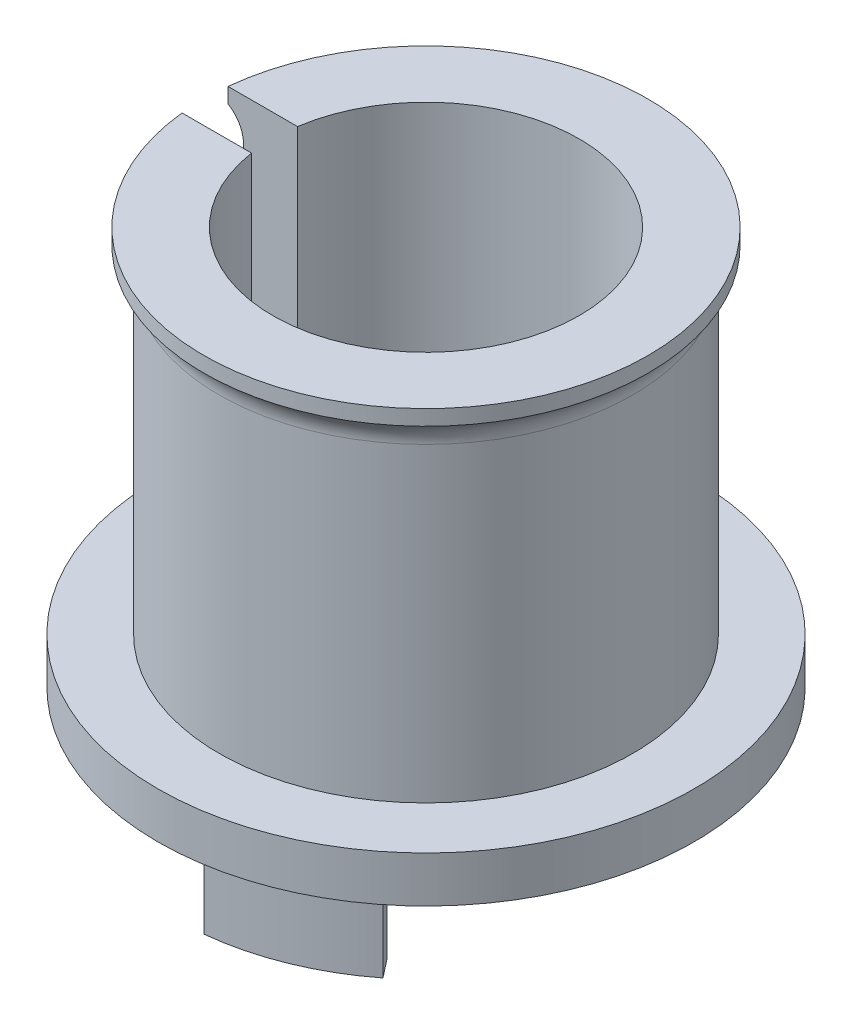
ISO-10303-21;
HEADER;
FILE_DESCRIPTION(('STEP AP214'),'2;1');
FILE_NAME('part.step','',(''),(''),'','','');
FILE_SCHEMA(('AUTOMOTIVE_DESIGN { 1 0 10303 214 1 1 1 1 }'));
ENDSEC;
DATA;
#1=APPLICATION_CONTEXT('core data for automotive mechanical design processes');
#2=APPLICATION_PROTOCOL_DEFINITION('international standard','automotive_design',2000,#1);
#3=PRODUCT_CONTEXT('',#1,'mechanical');
#4=PRODUCT('Part','Part','',(#3));
#5=PRODUCT_RELATED_PRODUCT_CATEGORY('part','',(#4));
#6=PRODUCT_DEFINITION_FORMATION('','',#4);
#7=PRODUCT_DEFINITION_CONTEXT('part definition',#1,'design');
#8=PRODUCT_DEFINITION('design','',#6,#7);
#9=PRODUCT_DEFINITION_SHAPE('','',#8);
#10=(LENGTH_UNIT() NAMED_UNIT(*) SI_UNIT(.MILLI.,.METRE.));
#11=(NAMED_UNIT(*) PLANE_ANGLE_UNIT() SI_UNIT($,.RADIAN.));
#12=(NAMED_UNIT(*) SI_UNIT($,.STERADIAN.) SOLID_ANGLE_UNIT());
#13=UNCERTAINTY_MEASURE_WITH_UNIT(LENGTH_MEASURE(1.E-05),#10,'distance_accuracy_value','');
#14=(GEOMETRIC_REPRESENTATION_CONTEXT(3) GLOBAL_UNCERTAINTY_ASSIGNED_CONTEXT((#13)) GLOBAL_UNIT_ASSIGNED_CONTEXT((#10,
#11,#12)) REPRESENTATION_CONTEXT('',''));
#15=CARTESIAN_POINT('',(0.,0.,0.));
#16=DIRECTION('',(0.,0.,1.));
#17=DIRECTION('',(1.,0.,0.));
#18=AXIS2_PLACEMENT_3D('',#15,#16,#17);
#19=CARTESIAN_POINT('',(0.,-3.,0.));
#20=DIRECTION('',(0.,1.,0.));
#21=DIRECTION('',(0.,0.,1.));
#22=AXIS2_PLACEMENT_3D('',#19,#20,#21);
#23=PLANE('',#22);
#24=CARTESIAN_POINT('',(0.,-3.,0.));
#25=DIRECTION('',(0.,1.,0.));
#26=DIRECTION('',(0.,0.,-1.));
#27=AXIS2_PLACEMENT_3D('',#24,#25,#26);
#28=CIRCLE('',#27,14.8);
#29=CARTESIAN_POINT('',(9.11178983481976,-3.,-11.6625591533795));
#30=VERTEX_POINT('',#29);
#31=CARTESIAN_POINT('',(1.54702125636129,-3.,-14.7189240514504));
#32=VERTEX_POINT('',#31);
#33=EDGE_CURVE('E116',#30,#32,#28,.T.);
#34=ORIENTED_EDGE('',*,*,#33,.F.);
#35=DIRECTION('',(-0.61566147532566,0.,0.78801075360672));
#36=VECTOR('',#35,1.);
#37=CARTESIAN_POINT('',(9.11178983481976,-3.,-11.6625591533795));
#38=LINE('',#37,#36);
#39=CARTESIAN_POINT('',(10.0352820478083,-3.,-12.8445752837895));
#40=VERTEX_POINT('',#39);
#41=EDGE_CURVE('E149',#40,#30,#38,.T.);
#42=ORIENTED_EDGE('',*,*,#41,.F.);
#43=CARTESIAN_POINT('',(0.,-3.,0.));
#44=DIRECTION('',(0.,-1.,0.));
#45=DIRECTION('',(0.,0.,-1.));
#46=AXIS2_PLACEMENT_3D('',#43,#44,#45);
#47=CIRCLE('',#46,16.3);
#48=CARTESIAN_POINT('',(1.70381395126277,-3.,-16.2107068945029));
#49=VERTEX_POINT('',#48);
#50=EDGE_CURVE('E161',#49,#40,#47,.T.);
#51=ORIENTED_EDGE('',*,*,#50,.F.);
#52=DIRECTION('',(0.104528463267654,0.,-0.994521895368273));
#53=VECTOR('',#52,1.);
#54=CARTESIAN_POINT('',(1.54702125636129,-3.,-14.7189240514504));
#55=LINE('',#54,#53);
#56=EDGE_CURVE('E158',#32,#49,#55,.T.);
#57=ORIENTED_EDGE('',*,*,#56,.F.);
#58=EDGE_LOOP('',(#34,#42,#51,#57));
#59=FACE_BOUND('',#58,.T.);
#60=CARTESIAN_POINT('',(0.,-3.,0.));
#61=DIRECTION('',(0.,1.,0.));
#62=DIRECTION('',(0.,0.,1.));
#63=AXIS2_PLACEMENT_3D('',#60,#61,#62);
#64=CIRCLE('',#63,17.5);
#65=CARTESIAN_POINT('',(0.,-3.,17.5));
#66=VERTEX_POINT('',#65);
#67=EDGE_CURVE('E56',#66,#66,#64,.T.);
#68=ORIENTED_EDGE('',*,*,#67,.F.);
#69=EDGE_LOOP('',(#68));
#70=FACE_BOUND('',#69,.T.);
#71=CARTESIAN_POINT('',(0.,-3.,0.));
#72=DIRECTION('',(0.,1.,0.));
#73=DIRECTION('',(0.,0.,1.));
#74=AXIS2_PLACEMENT_3D('',#71,#72,#73);
#75=CIRCLE('',#74,10.);
#76=CARTESIAN_POINT('',(0.,-3.,10.));
#77=VERTEX_POINT('',#76);
#78=EDGE_CURVE('E12',#77,#77,#75,.T.);
#79=ORIENTED_EDGE('',*,*,#78,.T.);
#80=EDGE_LOOP('',(#79));
#81=FACE_BOUND('',#80,.T.);
#82=CARTESIAN_POINT('',(0.,-3.,0.));
#83=DIRECTION('',(0.,1.,0.));
#84=DIRECTION('',(0.,0.,-1.));
#85=AXIS2_PLACEMENT_3D('',#82,#83,#84);
#86=CIRCLE('',#85,14.8);
#87=CARTESIAN_POINT('',(1.54702125636117,-3.,14.7189240514505));
#88=VERTEX_POINT('',#87);
#89=CARTESIAN_POINT('',(9.11178983481967,-3.,11.6625591533795));
#90=VERTEX_POINT('',#89);
#91=EDGE_CURVE('E110',#88,#90,#86,.T.);
#92=ORIENTED_EDGE('',*,*,#91,.F.);
#93=DIRECTION('',(-0.104528463267646,0.,-0.994521895368274));
#94=VECTOR('',#93,1.);
#95=CARTESIAN_POINT('',(1.54702125636117,-3.,14.7189240514505));
#96=LINE('',#95,#94);
#97=CARTESIAN_POINT('',(1.70381395126264,-3.,16.2107068945029));
#98=VERTEX_POINT('',#97);
#99=EDGE_CURVE('E112',#98,#88,#96,.T.);
#100=ORIENTED_EDGE('',*,*,#99,.F.);
#101=CARTESIAN_POINT('',(0.,-3.,0.));
#102=DIRECTION('',(0.,-1.,0.));
#103=DIRECTION('',(0.,0.,-1.));
#104=AXIS2_PLACEMENT_3D('',#101,#102,#103);
#105=CIRCLE('',#104,16.3);
#106=CARTESIAN_POINT('',(10.0352820478082,-3.,12.8445752837896));
#107=VERTEX_POINT('',#106);
#108=EDGE_CURVE('E69',#107,#98,#105,.T.);
#109=ORIENTED_EDGE('',*,*,#108,.F.);
#110=DIRECTION('',(0.615661475325654,0.,0.788010753606725));
#111=VECTOR('',#110,1.);
#112=CARTESIAN_POINT('',(9.11178983481967,-3.,11.6625591533795));
#113=LINE('',#112,#111);
#114=EDGE_CURVE('E64',#90,#107,#113,.T.);
#115=ORIENTED_EDGE('',*,*,#114,.F.);
#116=EDGE_LOOP('',(#92,#100,#109,#115));
#117=FACE_BOUND('',#116,.T.);
#118=ADVANCED_FACE('F47',(#59,#70,#81,#117),#23,.F.);
#119=CARTESIAN_POINT('',(0.,-3.,0.));
#120=DIRECTION('',(0.,1.,0.));
#121=DIRECTION('',(0.,0.,1.));
#122=AXIS2_PLACEMENT_3D('',#119,#120,#121);
#123=CYLINDRICAL_SURFACE('',#122,17.5);
#124=ORIENTED_EDGE('',*,*,#67,.T.);
#125=EDGE_LOOP('',(#124));
#126=FACE_BOUND('',#125,.T.);
#127=CARTESIAN_POINT('',(0.,0.,0.));
#128=DIRECTION('',(0.,1.,0.));
#129=DIRECTION('',(0.,0.,1.));
#130=AXIS2_PLACEMENT_3D('',#127,#128,#129);
#131=CIRCLE('',#130,17.5);
#132=CARTESIAN_POINT('',(0.,0.,17.5));
#133=VERTEX_POINT('',#132);
#134=EDGE_CURVE('E177',#133,#133,#131,.T.);
#135=ORIENTED_EDGE('',*,*,#134,.F.);
#136=EDGE_LOOP('',(#135));
#137=FACE_BOUND('',#136,.T.);
#138=ADVANCED_FACE('F49',(#126,#137),#123,.T.);
#139=CARTESIAN_POINT('',(0.,-3.,0.));
#140=DIRECTION('',(0.,1.,0.));
#141=DIRECTION('',(0.,0.,1.));
#142=AXIS2_PLACEMENT_3D('',#139,#140,#141);
#143=CYLINDRICAL_SURFACE('',#142,10.);
#144=ORIENTED_EDGE('',*,*,#78,.F.);
#145=EDGE_LOOP('',(#144));
#146=FACE_BOUND('',#145,.T.);
#147=CARTESIAN_POINT('',(0.,0.,0.));
#148=DIRECTION('',(0.,1.,0.));
#149=DIRECTION('',(0.,0.,1.));
#150=AXIS2_PLACEMENT_3D('',#147,#148,#149);
#151=CIRCLE('',#150,10.);
#152=CARTESIAN_POINT('',(0.,0.,10.));
#153=VERTEX_POINT('',#152);
#154=EDGE_CURVE('E51',#153,#153,#151,.T.);
#155=ORIENTED_EDGE('',*,*,#154,.T.);
#156=EDGE_LOOP('',(#155));
#157=FACE_BOUND('',#156,.T.);
#158=ADVANCED_FACE('F185',(#146,#157),#143,.F.);
#159=CARTESIAN_POINT('',(0.,0.,0.));
#160=DIRECTION('',(0.,1.,0.));
#161=DIRECTION('',(0.,0.,1.));
#162=AXIS2_PLACEMENT_3D('',#159,#160,#161);
#163=PLANE('',#162);
#164=ORIENTED_EDGE('',*,*,#134,.T.);
#165=EDGE_LOOP('',(#164));
#166=FACE_BOUND('',#165,.T.);
#167=ORIENTED_EDGE('',*,*,#154,.F.);
#168=EDGE_LOOP('',(#167));
#169=FACE_BOUND('',#168,.T.);
#170=ADVANCED_FACE('F187',(#166,#169),#163,.T.);
#171=CARTESIAN_POINT('',(0.,-8.,0.));
#172=DIRECTION('',(0.,1.,0.));
#173=DIRECTION('',(0.,0.,1.));
#174=AXIS2_PLACEMENT_3D('',#171,#172,#173);
#175=CYLINDRICAL_SURFACE('',#174,14.8);
#176=ORIENTED_EDGE('',*,*,#33,.T.);
#177=DIRECTION('',(0.,1.,0.));
#178=VECTOR('',#177,1.);
#179=CARTESIAN_POINT('',(1.54702125636129,-8.,-14.7189240514504));
#180=LINE('',#179,#178);
#181=CARTESIAN_POINT('',(1.54702125636129,-8.,-14.7189240514504));
#182=VERTEX_POINT('',#181);
#183=EDGE_CURVE('E174',#182,#32,#180,.T.);
#184=ORIENTED_EDGE('',*,*,#183,.F.);
#185=CARTESIAN_POINT('',(0.,-8.,0.));
#186=DIRECTION('',(0.,1.,0.));
#187=DIRECTION('',(0.,0.,-1.));
#188=AXIS2_PLACEMENT_3D('',#185,#186,#187);
#189=CIRCLE('',#188,14.8);
#190=CARTESIAN_POINT('',(9.11178983481976,-8.,-11.6625591533795));
#191=VERTEX_POINT('',#190);
#192=EDGE_CURVE('E145',#191,#182,#189,.T.);
#193=ORIENTED_EDGE('',*,*,#192,.F.);
#194=DIRECTION('',(0.,1.,0.));
#195=VECTOR('',#194,1.);
#196=CARTESIAN_POINT('',(9.11178983481976,-8.,-11.6625591533795));
#197=LINE('',#196,#195);
#198=EDGE_CURVE('E155',#191,#30,#197,.T.);
#199=ORIENTED_EDGE('',*,*,#198,.T.);
#200=EDGE_LOOP('',(#176,#184,#193,#199));
#201=FACE_BOUND('',#200,.T.);
#202=ADVANCED_FACE('F189',(#201),#175,.F.);
#203=CARTESIAN_POINT('',(1.54702125636129,-8.,-14.7189240514504));
#204=DIRECTION('',(0.994521895368273,0.,0.104528463267654));
#205=DIRECTION('',(0.104528463267654,0.,-0.994521895368273));
#206=AXIS2_PLACEMENT_3D('',#203,#204,#205);
#207=PLANE('',#206);
#208=ORIENTED_EDGE('',*,*,#56,.T.);
#209=DIRECTION('',(0.,1.,0.));
#210=VECTOR('',#209,1.);
#211=CARTESIAN_POINT('',(1.70381395126277,-8.,-16.2107068945029));
#212=LINE('',#211,#210);
#213=CARTESIAN_POINT('',(1.70381395126277,-8.,-16.2107068945029));
#214=VERTEX_POINT('',#213);
#215=EDGE_CURVE('E171',#214,#49,#212,.T.);
#216=ORIENTED_EDGE('',*,*,#215,.F.);
#217=DIRECTION('',(0.104528463267654,0.,-0.994521895368273));
#218=VECTOR('',#217,1.);
#219=CARTESIAN_POINT('',(1.54702125636129,-8.,-14.7189240514504));
#220=LINE('',#219,#218);
#221=EDGE_CURVE('E148',#182,#214,#220,.T.);
#222=ORIENTED_EDGE('',*,*,#221,.F.);
#223=ORIENTED_EDGE('',*,*,#183,.T.);
#224=EDGE_LOOP('',(#208,#216,#222,#223));
#225=FACE_BOUND('',#224,.T.);
#226=ADVANCED_FACE('F195',(#225),#207,.F.);
#227=CARTESIAN_POINT('',(0.,-8.,0.));
#228=DIRECTION('',(0.,1.,0.));
#229=DIRECTION('',(0.,0.,1.));
#230=AXIS2_PLACEMENT_3D('',#227,#228,#229);
#231=CYLINDRICAL_SURFACE('',#230,16.3);
#232=ORIENTED_EDGE('',*,*,#50,.T.);
#233=DIRECTION('',(0.,1.,0.));
#234=VECTOR('',#233,1.);
#235=CARTESIAN_POINT('',(10.0352820478083,-8.,-12.8445752837896));
#236=LINE('',#235,#234);
#237=CARTESIAN_POINT('',(10.0352820478083,-8.,-12.8445752837896));
#238=VERTEX_POINT('',#237);
#239=EDGE_CURVE('E168',#238,#40,#236,.T.);
#240=ORIENTED_EDGE('',*,*,#239,.F.);
#241=CARTESIAN_POINT('',(0.,-8.,0.));
#242=DIRECTION('',(0.,-1.,0.));
#243=DIRECTION('',(0.,0.,-1.));
#244=AXIS2_PLACEMENT_3D('',#241,#242,#243);
#245=CIRCLE('',#244,16.3);
#246=EDGE_CURVE('E151',#214,#238,#245,.T.);
#247=ORIENTED_EDGE('',*,*,#246,.F.);
#248=ORIENTED_EDGE('',*,*,#215,.T.);
#249=EDGE_LOOP('',(#232,#240,#247,#248));
#250=FACE_BOUND('',#249,.T.);
#251=ADVANCED_FACE('F210',(#250),#231,.T.);
#252=CARTESIAN_POINT('',(9.11178983481976,-8.,-11.6625591533795));
#253=DIRECTION('',(-0.78801075360672,0.,-0.61566147532566));
#254=DIRECTION('',(-0.61566147532566,0.,0.78801075360672));
#255=AXIS2_PLACEMENT_3D('',#252,#253,#254);
#256=PLANE('',#255);
#257=ORIENTED_EDGE('',*,*,#41,.T.);
#258=ORIENTED_EDGE('',*,*,#198,.F.);
#259=DIRECTION('',(-0.61566147532566,0.,0.78801075360672));
#260=VECTOR('',#259,1.);
#261=CARTESIAN_POINT('',(9.11178983481976,-8.,-11.6625591533795));
#262=LINE('',#261,#260);
#263=EDGE_CURVE('E153',#238,#191,#262,.T.);
#264=ORIENTED_EDGE('',*,*,#263,.F.);
#265=ORIENTED_EDGE('',*,*,#239,.T.);
#266=EDGE_LOOP('',(#257,#258,#264,#265));
#267=FACE_BOUND('',#266,.T.);
#268=ADVANCED_FACE('F214',(#267),#256,.F.);
#269=CARTESIAN_POINT('',(0.,-8.,0.));
#270=DIRECTION('',(0.,-1.,0.));
#271=DIRECTION('',(0.,0.,-1.));
#272=AXIS2_PLACEMENT_3D('',#269,#270,#271);
#273=PLANE('',#272);
#274=ORIENTED_EDGE('',*,*,#192,.T.);
#275=ORIENTED_EDGE('',*,*,#221,.T.);
#276=ORIENTED_EDGE('',*,*,#246,.T.);
#277=ORIENTED_EDGE('',*,*,#263,.T.);
#278=EDGE_LOOP('',(#274,#275,#276,#277));
#279=FACE_BOUND('',#278,.T.);
#280=ADVANCED_FACE('F218',(#279),#273,.T.);
#281=CARTESIAN_POINT('',(0.,-8.,0.));
#282=DIRECTION('',(0.,1.,0.));
#283=DIRECTION('',(0.,0.,1.));
#284=AXIS2_PLACEMENT_3D('',#281,#282,#283);
#285=CYLINDRICAL_SURFACE('',#284,14.8);
#286=ORIENTED_EDGE('',*,*,#91,.T.);
#287=DIRECTION('',(0.,1.,0.));
#288=VECTOR('',#287,1.);
#289=CARTESIAN_POINT('',(9.11178983481967,-8.,11.6625591533795));
#290=LINE('',#289,#288);
#291=CARTESIAN_POINT('',(9.11178983481967,-8.,11.6625591533795));
#292=VERTEX_POINT('',#291);
#293=EDGE_CURVE('E355',#292,#90,#290,.T.);
#294=ORIENTED_EDGE('',*,*,#293,.F.);
#295=CARTESIAN_POINT('',(0.,-8.,0.));
#296=DIRECTION('',(0.,1.,0.));
#297=DIRECTION('',(0.,0.,-1.));
#298=AXIS2_PLACEMENT_3D('',#295,#296,#297);
#299=CIRCLE('',#298,14.8);
#300=CARTESIAN_POINT('',(1.54702125636117,-8.,14.7189240514505));
#301=VERTEX_POINT('',#300);
#302=EDGE_CURVE('E127',#301,#292,#299,.T.);
#303=ORIENTED_EDGE('',*,*,#302,.F.);
#304=DIRECTION('',(0.,1.,0.));
#305=VECTOR('',#304,1.);
#306=CARTESIAN_POINT('',(1.54702125636117,-8.,14.7189240514505));
#307=LINE('',#306,#305);
#308=EDGE_CURVE('E123',#301,#88,#307,.T.);
#309=ORIENTED_EDGE('',*,*,#308,.T.);
#310=EDGE_LOOP('',(#286,#294,#303,#309));
#311=FACE_BOUND('',#310,.T.);
#312=ADVANCED_FACE('F129',(#311),#285,.F.);
#313=CARTESIAN_POINT('',(9.11178983481967,-8.,11.6625591533795));
#314=DIRECTION('',(-0.788010753606725,0.,0.615661475325654));
#315=DIRECTION('',(0.615661475325654,0.,0.788010753606726));
#316=AXIS2_PLACEMENT_3D('',#313,#314,#315);
#317=PLANE('',#316);
#318=ORIENTED_EDGE('',*,*,#114,.T.);
#319=DIRECTION('',(0.,1.,0.));
#320=VECTOR('',#319,1.);
#321=CARTESIAN_POINT('',(10.0352820478082,-8.,12.8445752837896));
#322=LINE('',#321,#320);
#323=CARTESIAN_POINT('',(10.0352820478082,-8.,12.8445752837896));
#324=VERTEX_POINT('',#323);
#325=EDGE_CURVE('E135',#324,#107,#322,.T.);
#326=ORIENTED_EDGE('',*,*,#325,.F.);
#327=DIRECTION('',(0.615661475325654,0.,0.788010753606725));
#328=VECTOR('',#327,1.);
#329=CARTESIAN_POINT('',(9.11178983481967,-8.,11.6625591533795));
#330=LINE('',#329,#328);
#331=EDGE_CURVE('E142',#292,#324,#330,.T.);
#332=ORIENTED_EDGE('',*,*,#331,.F.);
#333=ORIENTED_EDGE('',*,*,#293,.T.);
#334=EDGE_LOOP('',(#318,#326,#332,#333));
#335=FACE_BOUND('',#334,.T.);
#336=ADVANCED_FACE('F232',(#335),#317,.F.);
#337=CARTESIAN_POINT('',(0.,-8.,0.));
#338=DIRECTION('',(0.,1.,0.));
#339=DIRECTION('',(0.,0.,1.));
#340=AXIS2_PLACEMENT_3D('',#337,#338,#339);
#341=CYLINDRICAL_SURFACE('',#340,16.3);
#342=ORIENTED_EDGE('',*,*,#108,.T.);
#343=DIRECTION('',(0.,1.,0.));
#344=VECTOR('',#343,1.);
#345=CARTESIAN_POINT('',(1.70381395126263,-8.,16.2107068945029));
#346=LINE('',#345,#344);
#347=CARTESIAN_POINT('',(1.70381395126263,-8.,16.2107068945029));
#348=VERTEX_POINT('',#347);
#349=EDGE_CURVE('E126',#348,#98,#346,.T.);
#350=ORIENTED_EDGE('',*,*,#349,.F.);
#351=CARTESIAN_POINT('',(0.,-8.,0.));
#352=DIRECTION('',(0.,-1.,0.));
#353=DIRECTION('',(0.,0.,-1.));
#354=AXIS2_PLACEMENT_3D('',#351,#352,#353);
#355=CIRCLE('',#354,16.3);
#356=EDGE_CURVE('E133',#324,#348,#355,.T.);
#357=ORIENTED_EDGE('',*,*,#356,.F.);
#358=ORIENTED_EDGE('',*,*,#325,.T.);
#359=EDGE_LOOP('',(#342,#350,#357,#358));
#360=FACE_BOUND('',#359,.T.);
#361=ADVANCED_FACE('F229',(#360),#341,.T.);
#362=CARTESIAN_POINT('',(1.54702125636117,-8.,14.7189240514505));
#363=DIRECTION('',(0.994521895368274,0.,-0.104528463267646));
#364=DIRECTION('',(-0.104528463267646,0.,-0.994521895368274));
#365=AXIS2_PLACEMENT_3D('',#362,#363,#364);
#366=PLANE('',#365);
#367=ORIENTED_EDGE('',*,*,#99,.T.);
#368=ORIENTED_EDGE('',*,*,#308,.F.);
#369=DIRECTION('',(-0.104528463267646,0.,-0.994521895368274));
#370=VECTOR('',#369,1.);
#371=CARTESIAN_POINT('',(1.54702125636117,-8.,14.7189240514505));
#372=LINE('',#371,#370);
#373=EDGE_CURVE('E131',#348,#301,#372,.T.);
#374=ORIENTED_EDGE('',*,*,#373,.F.);
#375=ORIENTED_EDGE('',*,*,#349,.T.);
#376=EDGE_LOOP('',(#367,#368,#374,#375));
#377=FACE_BOUND('',#376,.T.);
#378=ADVANCED_FACE('F121',(#377),#366,.F.);
#379=CARTESIAN_POINT('',(0.,-8.,0.));
#380=DIRECTION('',(0.,-1.,0.));
#381=DIRECTION('',(0.,0.,-1.));
#382=AXIS2_PLACEMENT_3D('',#379,#380,#381);
#383=PLANE('',#382);
#384=ORIENTED_EDGE('',*,*,#302,.T.);
#385=ORIENTED_EDGE('',*,*,#331,.T.);
#386=ORIENTED_EDGE('',*,*,#356,.T.);
#387=ORIENTED_EDGE('',*,*,#373,.T.);
#388=EDGE_LOOP('',(#384,#385,#386,#387));
#389=FACE_BOUND('',#388,.T.);
#390=ADVANCED_FACE('F223',(#389),#383,.T.);
#391=CLOSED_SHELL('',(#118,#138,#158,#170,#202,#226,#251,#268,#280,#312,#336,#361,#378,#390));
#392=MANIFOLD_SOLID_BREP('B2',#391);
#393=CARTESIAN_POINT('',(0.,22.,0.));
#394=DIRECTION('',(0.,-1.,0.));
#395=DIRECTION('',(0.,0.,-1.));
#396=AXIS2_PLACEMENT_3D('',#393,#394,#395);
#397=CYLINDRICAL_SURFACE('',#396,10.);
#398=DIRECTION('',(0.,1.,0.));
#399=VECTOR('',#398,1.);
#400=CARTESIAN_POINT('',(-9.88685996664259,-5.50282299982153,-1.50000000000001));
#401=LINE('',#400,#399);
#402=CARTESIAN_POINT('',(-9.88685996664259,0.,-1.50000000000001));
#403=VERTEX_POINT('',#402);
#404=CARTESIAN_POINT('',(-9.88685996664259,23.,-1.50000000000001));
#405=VERTEX_POINT('',#404);
#406=EDGE_CURVE('E488',#403,#405,#401,.T.);
#407=ORIENTED_EDGE('',*,*,#406,.F.);
#408=CARTESIAN_POINT('',(0.,0.,0.));
#409=DIRECTION('',(0.,1.,0.));
#410=DIRECTION('',(0.,0.,1.));
#411=AXIS2_PLACEMENT_3D('',#408,#409,#410);
#412=CIRCLE('',#411,10.);
#413=CARTESIAN_POINT('',(-9.88685996664259,0.,1.5));
#414=VERTEX_POINT('',#413);
#415=EDGE_CURVE('E448',#414,#403,#412,.T.);
#416=ORIENTED_EDGE('',*,*,#415,.F.);
#417=DIRECTION('',(0.,1.,0.));
#418=VECTOR('',#417,1.);
#419=CARTESIAN_POINT('',(-9.88685996664259,-5.50282299982153,1.5));
#420=LINE('',#419,#418);
#421=CARTESIAN_POINT('',(-9.88685996664259,23.,1.5));
#422=VERTEX_POINT('',#421);
#423=EDGE_CURVE('E435',#414,#422,#420,.T.);
#424=ORIENTED_EDGE('',*,*,#423,.T.);
#425=CARTESIAN_POINT('',(0.,23.,0.));
#426=DIRECTION('',(0.,1.,0.));
#427=DIRECTION('',(0.,0.,1.));
#428=AXIS2_PLACEMENT_3D('',#425,#426,#427);
#429=CIRCLE('',#428,10.);
#430=EDGE_CURVE('E445',#422,#405,#429,.T.);
#431=ORIENTED_EDGE('',*,*,#430,.T.);
#432=EDGE_LOOP('',(#407,#416,#424,#431));
#433=FACE_BOUND('',#432,.T.);
#434=ADVANCED_FACE('F371',(#433),#397,.F.);
#435=CARTESIAN_POINT('',(0.,22.,0.));
#436=DIRECTION('',(0.,-1.,0.));
#437=DIRECTION('',(0.,0.,-1.));
#438=AXIS2_PLACEMENT_3D('',#435,#436,#437);
#439=CYLINDRICAL_SURFACE('',#438,13.5);
#440=CARTESIAN_POINT('',(0.,0.,0.));
#441=DIRECTION('',(0.,1.,0.));
#442=DIRECTION('',(0.,0.,1.));
#443=AXIS2_PLACEMENT_3D('',#440,#441,#442);
#444=CIRCLE('',#443,13.5);
#445=CARTESIAN_POINT('',(-13.4164078649987,0.,1.5));
#446=VERTEX_POINT('',#445);
#447=CARTESIAN_POINT('',(-13.4164078649987,0.,-1.5));
#448=VERTEX_POINT('',#447);
#449=EDGE_CURVE('E452',#446,#448,#444,.T.);
#450=ORIENTED_EDGE('',*,*,#449,.T.);
#451=DIRECTION('',(0.,-1.,0.));
#452=VECTOR('',#451,1.);
#453=CARTESIAN_POINT('',(-13.4164078649987,22.,-1.5));
#454=LINE('',#453,#452);
#455=CARTESIAN_POINT('',(-13.4164078649987,20.2679491924311,-1.5));
#456=VERTEX_POINT('',#455);
#457=EDGE_CURVE('E496',#448,#456,#454,.F.);
#458=ORIENTED_EDGE('',*,*,#457,.T.);
#459=CARTESIAN_POINT('',(0.,20.2679491924311,0.));
#460=DIRECTION('',(0.,1.,0.));
#461=DIRECTION('',(0.,0.,1.));
#462=AXIS2_PLACEMENT_3D('',#459,#460,#461);
#463=CIRCLE('',#462,13.5);
#464=CARTESIAN_POINT('',(-13.4164078649987,20.2679491924311,1.5));
#465=VERTEX_POINT('',#464);
#466=EDGE_CURVE('E460',#456,#465,#463,.F.);
#467=ORIENTED_EDGE('',*,*,#466,.T.);
#468=DIRECTION('',(0.,-1.,0.));
#469=VECTOR('',#468,1.);
#470=CARTESIAN_POINT('',(-13.4164078649987,22.,1.5));
#471=LINE('',#470,#469);
#472=EDGE_CURVE('E398',#465,#446,#471,.T.);
#473=ORIENTED_EDGE('',*,*,#472,.T.);
#474=EDGE_LOOP('',(#450,#458,#467,#473));
#475=FACE_BOUND('',#474,.T.);
#476=ADVANCED_FACE('F478',(#475),#439,.T.);
#477=CARTESIAN_POINT('',(0.,0.,0.));
#478=DIRECTION('',(0.,1.,0.));
#479=DIRECTION('',(0.,0.,1.));
#480=AXIS2_PLACEMENT_3D('',#477,#478,#479);
#481=PLANE('',#480);
#482=ORIENTED_EDGE('',*,*,#415,.T.);
#483=DIRECTION('',(1.,0.,0.));
#484=VECTOR('',#483,1.);
#485=CARTESIAN_POINT('',(-9.88685996664259,0.,-1.5));
#486=LINE('',#485,#484);
#487=EDGE_CURVE('E493',#448,#403,#486,.T.);
#488=ORIENTED_EDGE('',*,*,#487,.F.);
#489=ORIENTED_EDGE('',*,*,#449,.F.);
#490=DIRECTION('',(-1.,0.,0.));
#491=VECTOR('',#490,1.);
#492=CARTESIAN_POINT('',(-9.88685996664259,0.,1.5));
#493=LINE('',#492,#491);
#494=EDGE_CURVE('E494',#414,#446,#493,.T.);
#495=ORIENTED_EDGE('',*,*,#494,.F.);
#496=EDGE_LOOP('',(#482,#488,#489,#495));
#497=FACE_BOUND('',#496,.T.);
#498=ADVANCED_FACE('F473',(#497),#481,.F.);
#499=CARTESIAN_POINT('',(0.,23.,0.));
#500=DIRECTION('',(0.,1.,0.));
#501=DIRECTION('',(0.,0.,1.));
#502=AXIS2_PLACEMENT_3D('',#499,#500,#501);
#503=PLANE('',#502);
#504=DIRECTION('',(-1.,0.,0.));
#505=VECTOR('',#504,1.);
#506=CARTESIAN_POINT('',(-9.88685996664259,23.,-1.5));
#507=LINE('',#506,#505);
#508=CARTESIAN_POINT('',(-14.422205101856,23.,-1.5));
#509=VERTEX_POINT('',#508);
#510=EDGE_CURVE('E436',#405,#509,#507,.T.);
#511=ORIENTED_EDGE('',*,*,#510,.F.);
#512=ORIENTED_EDGE('',*,*,#430,.F.);
#513=DIRECTION('',(1.,0.,0.));
#514=VECTOR('',#513,1.);
#515=CARTESIAN_POINT('',(-9.88685996664259,23.,1.5));
#516=LINE('',#515,#514);
#517=CARTESIAN_POINT('',(-14.422205101856,23.,1.5));
#518=VERTEX_POINT('',#517);
#519=EDGE_CURVE('E429',#518,#422,#516,.T.);
#520=ORIENTED_EDGE('',*,*,#519,.F.);
#521=CARTESIAN_POINT('',(0.,23.,0.));
#522=DIRECTION('',(0.,1.,0.));
#523=DIRECTION('',(0.,0.,1.));
#524=AXIS2_PLACEMENT_3D('',#521,#522,#523);
#525=CIRCLE('',#524,14.5);
#526=EDGE_CURVE('E443',#518,#509,#525,.T.);
#527=ORIENTED_EDGE('',*,*,#526,.T.);
#528=EDGE_LOOP('',(#511,#512,#520,#527));
#529=FACE_BOUND('',#528,.T.);
#530=ADVANCED_FACE('F442',(#529),#503,.T.);
#531=CARTESIAN_POINT('',(0.,23.,0.));
#532=DIRECTION('',(0.,-1.,0.));
#533=DIRECTION('',(0.,0.,-1.));
#534=AXIS2_PLACEMENT_3D('',#531,#532,#533);
#535=CYLINDRICAL_SURFACE('',#534,14.5);
#536=CARTESIAN_POINT('',(0.,22.,0.));
#537=DIRECTION('',(0.,1.,0.));
#538=DIRECTION('',(0.,0.,1.));
#539=AXIS2_PLACEMENT_3D('',#536,#537,#538);
#540=CIRCLE('',#539,14.5);
#541=CARTESIAN_POINT('',(-14.422205101856,22.,1.5));
#542=VERTEX_POINT('',#541);
#543=CARTESIAN_POINT('',(-14.422205101856,22.,-1.5));
#544=VERTEX_POINT('',#543);
#545=EDGE_CURVE('E449',#542,#544,#540,.T.);
#546=ORIENTED_EDGE('',*,*,#545,.T.);
#547=DIRECTION('',(0.,1.,0.));
#548=VECTOR('',#547,1.);
#549=CARTESIAN_POINT('',(-14.422205101856,-5.50282299982153,-1.5));
#550=LINE('',#549,#548);
#551=EDGE_CURVE('E391',#544,#509,#550,.T.);
#552=ORIENTED_EDGE('',*,*,#551,.T.);
#553=ORIENTED_EDGE('',*,*,#526,.F.);
#554=DIRECTION('',(0.,1.,0.));
#555=VECTOR('',#554,1.);
#556=CARTESIAN_POINT('',(-14.422205101856,-5.50282299982153,1.5));
#557=LINE('',#556,#555);
#558=EDGE_CURVE('E426',#542,#518,#557,.T.);
#559=ORIENTED_EDGE('',*,*,#558,.F.);
#560=EDGE_LOOP('',(#546,#552,#553,#559));
#561=FACE_BOUND('',#560,.T.);
#562=ADVANCED_FACE('F447',(#561),#535,.T.);
#563=CARTESIAN_POINT('',(0.,20.2679491924311,0.));
#564=DIRECTION('',(0.,1.,0.));
#565=DIRECTION('',(0.,0.,1.));
#566=AXIS2_PLACEMENT_3D('',#563,#564,#565);
#567=TOROIDAL_SURFACE('',#566,15.5,2.);
#568=ORIENTED_EDGE('',*,*,#466,.F.);
#569=CARTESIAN_POINT('',(-13.6688450736581,21.2378248077881,-1.5));
#570=CARTESIAN_POINT('',(-13.7237406852319,21.3362235648098,-1.5));
#571=CARTESIAN_POINT('',(-13.7870241951649,21.4300400083472,-1.5));
#572=CARTESIAN_POINT('',(-13.9285196208326,21.6057756559942,-1.5));
#573=CARTESIAN_POINT('',(-14.0067504073234,21.6876795879932,-1.5));
#574=CARTESIAN_POINT('',(-14.1757863830844,21.8371587422544,-1.5));
#575=CARTESIAN_POINT('',(-14.2665825620129,21.9047441448757,-1.5));
#576=CARTESIAN_POINT('',(-14.458170086044,22.0237615327117,-1.5));
#577=CARTESIAN_POINT('',(-14.5589589404766,22.075197529907,-1.5));
#578=CARTESIAN_POINT('',(-14.7681179236397,22.1606958578875,-1.5));
#579=CARTESIAN_POINT('',(-14.8765162613231,22.1946891911014,-1.5));
#580=CARTESIAN_POINT('',(-15.0974787794958,22.2440527491717,-1.5));
#581=CARTESIAN_POINT('',(-15.2100432052386,22.2594218758362,-1.5));
#582=CARTESIAN_POINT('',(-15.4364666309566,22.2711165658435,-1.5));
#583=CARTESIAN_POINT('',(-15.550328324369,22.267390076858,-1.5));
#584=CARTESIAN_POINT('',(-15.7758087363742,22.2408637864932,-1.5));
#585=CARTESIAN_POINT('',(-15.8874274565474,22.2180639985525,-1.5));
#586=CARTESIAN_POINT('',(-16.1051780310449,22.1540320689469,-1.5));
#587=CARTESIAN_POINT('',(-16.2113130116844,22.1128105619167,-1.5));
#588=CARTESIAN_POINT('',(-16.4151249513083,22.01308055526,-1.5));
#589=CARTESIAN_POINT('',(-16.5128020435734,21.9545723281042,-1.5));
#590=CARTESIAN_POINT('',(-16.6965996228547,21.8221144848173,-1.5));
#591=CARTESIAN_POINT('',(-16.7827546651499,21.7482128209991,-1.5));
#592=CARTESIAN_POINT('',(-16.941372917021,21.586941750849,-1.5));
#593=CARTESIAN_POINT('',(-17.013836398709,21.4995726122381,-1.5));
#594=CARTESIAN_POINT('',(-17.1427077712316,21.3142217693134,-1.5));
#595=CARTESIAN_POINT('',(-17.1991786572511,21.2162838636425,-1.5));
#596=CARTESIAN_POINT('',(-17.2948113815817,21.0122933060674,-1.5));
#597=CARTESIAN_POINT('',(-17.3339735725465,20.9062408195443,-1.5));
#598=CARTESIAN_POINT('',(-17.3937466263866,20.6894204318718,-1.5));
#599=CARTESIAN_POINT('',(-17.4144202168536,20.578669820557,-1.5));
#600=CARTESIAN_POINT('',(-17.4368441003107,20.3552695723282,-1.5));
#601=CARTESIAN_POINT('',(-17.438594629319,20.2426199591171,-1.5));
#602=CARTESIAN_POINT('',(-17.4231357301013,20.0188297743621,-1.5));
#603=CARTESIAN_POINT('',(-17.4059596868229,19.9076868946248,-1.5));
#604=CARTESIAN_POINT('',(-17.3531981763401,19.6898611375257,-1.5));
#605=CARTESIAN_POINT('',(-17.3176127445297,19.5831782515894,-1.5));
#606=CARTESIAN_POINT('',(-17.2290433219282,19.3772527785857,-1.5));
#607=CARTESIAN_POINT('',(-17.1760530369438,19.2780128991368,-1.5));
#608=CARTESIAN_POINT('',(-17.0542012057775,19.0898102429384,-1.5));
#609=CARTESIAN_POINT('',(-16.9853395101174,19.0008475629923,-1.5));
#610=CARTESIAN_POINT('',(-16.8335324751326,18.8354904274144,-1.5));
#611=CARTESIAN_POINT('',(-16.7505539782741,18.759126415015,-1.5));
#612=CARTESIAN_POINT('',(-16.5729955120902,18.6213513281903,-1.5));
#613=CARTESIAN_POINT('',(-16.4784153315922,18.5599405260026,-1.5));
#614=CARTESIAN_POINT('',(-16.2799627947353,18.4535682231409,-1.5));
#615=CARTESIAN_POINT('',(-16.1760571001233,18.4086689215835,-1.5));
#616=CARTESIAN_POINT('',(-15.9622013639618,18.3368758631551,-1.5));
#617=CARTESIAN_POINT('',(-15.8522511862704,18.3099825120181,-1.5));
#618=CARTESIAN_POINT('',(-15.6289721092771,18.2748627716201,-1.5));
#619=CARTESIAN_POINT('',(-15.5156317794608,18.2667090380384,-1.5));
#620=CARTESIAN_POINT('',(-15.2891855180978,18.2694949766891,-1.5));
#621=CARTESIAN_POINT('',(-15.1760795905116,18.2804349689529,-1.5));
#622=CARTESIAN_POINT('',(-14.9530223109581,18.3211468100873,-1.5));
#623=CARTESIAN_POINT('',(-14.843079335383,18.3509645731433,-1.5));
#624=CARTESIAN_POINT('',(-14.6297611152809,18.4286414468235,-1.5));
#625=CARTESIAN_POINT('',(-14.5263859087065,18.4765006616917,-1.5));
#626=CARTESIAN_POINT('',(-14.3291994145118,18.5889024847611,-1.5));
#627=CARTESIAN_POINT('',(-14.2353840361881,18.6534379149628,-1.5));
#628=CARTESIAN_POINT('',(-14.0599702058711,18.7973978127878,-1.5));
#629=CARTESIAN_POINT('',(-13.9783715756123,18.876822063117,-1.5));
#630=CARTESIAN_POINT('',(-13.8300463486722,19.048001007583,-1.5));
#631=CARTESIAN_POINT('',(-13.7632656213958,19.1397087914921,-1.5));
#632=CARTESIAN_POINT('',(-13.646153965134,19.3330824987616,-1.5));
#633=CARTESIAN_POINT('',(-13.595821854475,19.4347477060954,-1.5));
#634=CARTESIAN_POINT('',(-13.5133356041023,19.6445271361299,-1.5));
#635=CARTESIAN_POINT('',(-13.4810787225267,19.752600966485,-1.5));
#636=CARTESIAN_POINT('',(-13.4352530461292,19.9726711869816,-1.5));
#637=CARTESIAN_POINT('',(-13.421688391441,20.0846684404896,-1.5));
#638=CARTESIAN_POINT('',(-13.4136769351716,20.3088774827597,-1.5));
#639=CARTESIAN_POINT('',(-13.419152886404,20.4210865631177,-1.5));
#640=CARTESIAN_POINT('',(-13.4488922708941,20.6428902251882,-1.5));
#641=CARTESIAN_POINT('',(-13.4731326846792,20.7524878408533,-1.5));
#642=CARTESIAN_POINT('',(-13.5268078290441,20.9249048513542,-1.5));
#643=CARTESIAN_POINT('',(-13.5506663309673,20.9895149175249,-1.5));
#644=CARTESIAN_POINT('',(-13.6049220972186,21.1159279508623,-1.5));
#645=CARTESIAN_POINT('',(-13.6353193416215,21.1777309265822,-1.5));
#646=CARTESIAN_POINT('',(-13.6688450736581,21.2378248077881,-1.5));
#647=B_SPLINE_CURVE_WITH_KNOTS('',3,(#569,#570,#571,#572,#573,#574,#575,#576,#577,#578,#579,
#580,#581,#582,#583,#584,#585,#586,#587,#588,#589,#590,#591,#592,#593,#594,#595,#596,#597,#598,
#599,#600,#601,#602,#603,#604,#605,#606,#607,#608,#609,#610,#611,#612,#613,#614,#615,#616,#617,
#618,#619,#620,#621,#622,#623,#624,#625,#626,#627,#628,#629,#630,#631,#632,#633,#634,#635,#636,
#637,#638,#639,#640,#641,#642,#643,#644,#645,#646),.UNSPECIFIED.,.T.,.F.,(4,2,2,2,2,2,2,2,2,2,2,
2,2,2,2,2,2,2,2,2,2,2,2,2,2,2,2,2,2,2,2,2,2,2,2,2,2,2,4),(0.,0.33777451005294,0.67597830824708,
1.01394083323483,1.35181933197405,1.69102426091169,2.03024919037838,2.37039929686133,
2.71054916368295,3.05050291926969,3.39045131683921,3.72935616287795,4.06825427266836,
4.40579827389082,4.7433353975508,5.07972294208898,5.41610629102138,5.75189723530326,
6.08768753399069,6.42359939994358,6.75951442967284,7.09622963368279,7.43295096745822,
7.7709280491438,8.10891274632267,8.44820565481828,8.78750425028051,9.12763126891968,
9.46776025285034,9.8077430770798,10.1477209398311,10.4864356143893,10.8251259502305,
11.1618710752614,11.4986907738483,11.8341456017646,12.1691895583647,12.3754751228284,
12.5817600586941),.UNSPECIFIED.);
#648=EDGE_CURVE('E45',#456,#544,#647,.T.);
#649=ORIENTED_EDGE('',*,*,#648,.T.);
#650=ORIENTED_EDGE('',*,*,#545,.F.);
#651=CARTESIAN_POINT('',(-13.6688450736581,21.2378248077881,1.5));
#652=CARTESIAN_POINT('',(-13.6143680622649,21.1401558610753,1.5));
#653=CARTESIAN_POINT('',(-13.56807491018,21.0378317472081,1.5));
#654=CARTESIAN_POINT('',(-13.4932788626858,20.8267833244065,1.5));
#655=CARTESIAN_POINT('',(-13.4647962905417,20.7180518583606,1.5));
#656=CARTESIAN_POINT('',(-13.4265232868996,20.4973746310185,1.5));
#657=CARTESIAN_POINT('',(-13.4167264381994,20.385429986629,1.5));
#658=CARTESIAN_POINT('',(-13.4161046466627,20.1615172836847,1.5));
#659=CARTESIAN_POINT('',(-13.4252751481469,20.0495492372092,1.5));
#660=CARTESIAN_POINT('',(-13.4622760593064,19.8289155939986,1.5));
#661=CARTESIAN_POINT('',(-13.4900782019076,19.7202452548075,1.5));
#662=CARTESIAN_POINT('',(-13.5634969578455,19.5090964393689,1.5));
#663=CARTESIAN_POINT('',(-13.609114337174,19.4066182295797,1.5));
#664=CARTESIAN_POINT('',(-13.7169430481606,19.2105306334623,1.5));
#665=CARTESIAN_POINT('',(-13.7791878039528,19.1169396315018,1.5));
#666=CARTESIAN_POINT('',(-13.9184301763545,18.9414660521245,1.5));
#667=CARTESIAN_POINT('',(-13.9954281507347,18.8595837587319,1.5));
#668=CARTESIAN_POINT('',(-14.1624164388606,18.7093933227763,1.5));
#669=CARTESIAN_POINT('',(-14.2524722929718,18.6411580535282,1.5));
#670=CARTESIAN_POINT('',(-14.4427114361369,18.5206798527549,1.5));
#671=CARTESIAN_POINT('',(-14.5428950115085,18.4684373735251,1.5));
#672=CARTESIAN_POINT('',(-14.751120888088,18.38114762885,1.5));
#673=CARTESIAN_POINT('',(-14.8592021397402,18.3461932616265,1.5));
#674=CARTESIAN_POINT('',(-15.0796911927684,18.2948677163051,1.5));
#675=CARTESIAN_POINT('',(-15.1920990808813,18.2784969109555,1.5));
#676=CARTESIAN_POINT('',(-15.4183906579463,18.2647804746104,1.5));
#677=CARTESIAN_POINT('',(-15.5322776219913,18.2674887895619,1.5));
#678=CARTESIAN_POINT('',(-15.7579797241507,18.2919957674965,1.5));
#679=CARTESIAN_POINT('',(-15.8697948597916,18.3137944532694,1.5));
#680=CARTESIAN_POINT('',(-16.0881133523915,18.3758724763884,1.5));
#681=CARTESIAN_POINT('',(-16.1946193140293,18.4161426507023,1.5));
#682=CARTESIAN_POINT('',(-16.3993288720857,18.5140452999144,1.5));
#683=CARTESIAN_POINT('',(-16.4975325793127,18.5716775430379,1.5));
#684=CARTESIAN_POINT('',(-16.6825268603146,18.7024896324968,1.5));
#685=CARTESIAN_POINT('',(-16.7693510399322,18.7756219497296,1.5));
#686=CARTESIAN_POINT('',(-16.9294276722496,18.9354780098474,1.5));
#687=CARTESIAN_POINT('',(-17.0026804095221,19.022201467676,1.5));
#688=CARTESIAN_POINT('',(-17.1332247884794,19.2064062800747,1.5));
#689=CARTESIAN_POINT('',(-17.1905789755293,19.3038433100453,1.5));
#690=CARTESIAN_POINT('',(-17.2880495108874,19.5069883902797,1.5));
#691=CARTESIAN_POINT('',(-17.32816620432,19.6126962748965,1.5));
#692=CARTESIAN_POINT('',(-17.3898873034062,19.8289910676837,1.5));
#693=CARTESIAN_POINT('',(-17.4115548727208,19.9395599545986,1.5));
#694=CARTESIAN_POINT('',(-17.4359820612443,20.1627665444906,1.5));
#695=CARTESIAN_POINT('',(-17.4387419260946,20.2754042205718,1.5));
#696=CARTESIAN_POINT('',(-17.4252863191903,20.4993342454404,1.5));
#697=CARTESIAN_POINT('',(-17.4091052515129,20.6106286636064,1.5));
#698=CARTESIAN_POINT('',(-17.3582930323327,20.8289220387542,1.5));
#699=CARTESIAN_POINT('',(-17.3236619136035,20.9359210033658,1.5));
#700=CARTESIAN_POINT('',(-17.2369359665765,21.1426276301279,1.5));
#701=CARTESIAN_POINT('',(-17.1848358175831,21.2423330595379,1.5));
#702=CARTESIAN_POINT('',(-17.0646730072184,21.4316086236405,1.5));
#703=CARTESIAN_POINT('',(-16.9966102175313,21.521178676851,1.5));
#704=CARTESIAN_POINT('',(-16.8462927376205,21.6878722866542,1.5));
#705=CARTESIAN_POINT('',(-16.7640052903799,21.7649663015724,1.5));
#706=CARTESIAN_POINT('',(-16.587696692821,21.904306431376,1.5));
#707=CARTESIAN_POINT('',(-16.4936753082776,21.9665522497992,1.5));
#708=CARTESIAN_POINT('',(-16.2961971877466,22.0746777125358,1.5));
#709=CARTESIAN_POINT('',(-16.1927067819763,22.1204958610265,1.5));
#710=CARTESIAN_POINT('',(-15.9795220697478,22.1941834415256,1.5));
#711=CARTESIAN_POINT('',(-15.8698276143391,22.2220524424012,1.5));
#712=CARTESIAN_POINT('',(-15.6468905142056,22.2591577400097,1.5));
#713=CARTESIAN_POINT('',(-15.5336356880866,22.2683208619251,1.5));
#714=CARTESIAN_POINT('',(-15.3071943164697,22.2675543924671,1.5));
#715=CARTESIAN_POINT('',(-15.1940077696062,22.2576251965299,1.5));
#716=CARTESIAN_POINT('',(-14.9706257617794,22.2189135067047,1.5));
#717=CARTESIAN_POINT('',(-14.860438117722,22.1900858947573,1.5));
#718=CARTESIAN_POINT('',(-14.64643801183,22.1143260552023,1.5));
#719=CARTESIAN_POINT('',(-14.5426271614809,22.0673892728505,1.5));
#720=CARTESIAN_POINT('',(-14.3443704840402,21.9567239622966,1.5));
#721=CARTESIAN_POINT('',(-14.2499259476588,21.8929931242288,1.5));
#722=CARTESIAN_POINT('',(-14.0732167017187,21.7505670283879,1.5));
#723=CARTESIAN_POINT('',(-13.9909373090751,21.6718900768519,1.5));
#724=CARTESIAN_POINT('',(-13.8686702217063,21.5333344449125,1.5));
#725=CARTESIAN_POINT('',(-13.8242945087111,21.4772624993896,1.5));
#726=CARTESIAN_POINT('',(-13.7417811393407,21.3607017847201,1.5));
#727=CARTESIAN_POINT('',(-13.703643476521,21.3002130201365,1.5));
#728=CARTESIAN_POINT('',(-13.6688450736581,21.2378248077881,1.5));
#729=B_SPLINE_CURVE_WITH_KNOTS('',3,(#651,#652,#653,#654,#655,#656,#657,#658,#659,#660,#661,
#662,#663,#664,#665,#666,#667,#668,#669,#670,#671,#672,#673,#674,#675,#676,#677,#678,#679,#680,
#681,#682,#683,#684,#685,#686,#687,#688,#689,#690,#691,#692,#693,#694,#695,#696,#697,#698,#699,
#700,#701,#702,#703,#704,#705,#706,#707,#708,#709,#710,#711,#712,#713,#714,#715,#716,#717,#718,
#719,#720,#721,#722,#723,#724,#725,#726,#727,#728),.UNSPECIFIED.,.T.,.F.,(4,2,2,2,2,2,2,2,2,2,2,
2,2,2,2,2,2,2,2,2,2,2,2,2,2,2,2,2,2,2,2,2,2,2,2,2,2,2,4),(0.,0.335244199523722,
0.670870244170043,1.0063810046362,1.34181118969777,1.67673362405892,2.01167046048305,
2.34728571628189,2.68290911189395,3.0202794622448,3.35765935295742,3.69683298515706,
4.03601342036597,4.37615326767631,4.71629352104338,5.0562652254082,5.39623239152697,
5.73517179361062,6.07410408783841,6.41168345181692,6.74925605655904,7.08566822387626,
7.42207602065164,7.75787371739569,8.09367081765103,8.42957028761615,8.76547245780566,
9.10215871801247,9.43885170000734,9.77679222349426,10.1147408638992,10.4540089989153,
10.7932701071522,11.1333441311736,11.4735037450343,11.8137101691146,12.1535025586626,
12.367647469819,12.5817921597377),.UNSPECIFIED.);
#730=EDGE_CURVE('E384',#542,#465,#729,.T.);
#731=ORIENTED_EDGE('',*,*,#730,.T.);
#732=EDGE_LOOP('',(#568,#649,#650,#731));
#733=FACE_BOUND('',#732,.T.);
#734=ADVANCED_FACE('F373',(#733),#567,.F.);
#735=CARTESIAN_POINT('',(-9.88685996664259,-5.50282299982153,1.5));
#736=DIRECTION('',(0.,0.,1.));
#737=DIRECTION('',(1.,0.,0.));
#738=AXIS2_PLACEMENT_3D('',#735,#736,#737);
#739=PLANE('',#738);
#740=ORIENTED_EDGE('',*,*,#730,.F.);
#741=ORIENTED_EDGE('',*,*,#558,.T.);
#742=ORIENTED_EDGE('',*,*,#519,.T.);
#743=ORIENTED_EDGE('',*,*,#423,.F.);
#744=ORIENTED_EDGE('',*,*,#494,.T.);
#745=ORIENTED_EDGE('',*,*,#472,.F.);
#746=EDGE_LOOP('',(#740,#741,#742,#743,#744,#745));
#747=FACE_BOUND('',#746,.T.);
#748=ADVANCED_FACE('F428',(#747),#739,.F.);
#749=CARTESIAN_POINT('',(-9.88685996664259,-5.50282299982153,-1.5));
#750=DIRECTION('',(0.,0.,-1.));
#751=DIRECTION('',(-1.,0.,0.));
#752=AXIS2_PLACEMENT_3D('',#749,#750,#751);
#753=PLANE('',#752);
#754=ORIENTED_EDGE('',*,*,#487,.T.);
#755=ORIENTED_EDGE('',*,*,#406,.T.);
#756=ORIENTED_EDGE('',*,*,#510,.T.);
#757=ORIENTED_EDGE('',*,*,#551,.F.);
#758=ORIENTED_EDGE('',*,*,#648,.F.);
#759=ORIENTED_EDGE('',*,*,#457,.F.);
#760=EDGE_LOOP('',(#754,#755,#756,#757,#758,#759));
#761=FACE_BOUND('',#760,.T.);
#762=ADVANCED_FACE('F469',(#761),#753,.F.);
#763=CLOSED_SHELL('',(#434,#476,#498,#530,#562,#734,#748,#762));
#764=MANIFOLD_SOLID_BREP('B6',#763);
#765=ADVANCED_BREP_SHAPE_REPRESENTATION('',(#18,#392,#764),#14);
#766=SHAPE_DEFINITION_REPRESENTATION(#9,#765);
ENDSEC;
END-ISO-10303-21;
